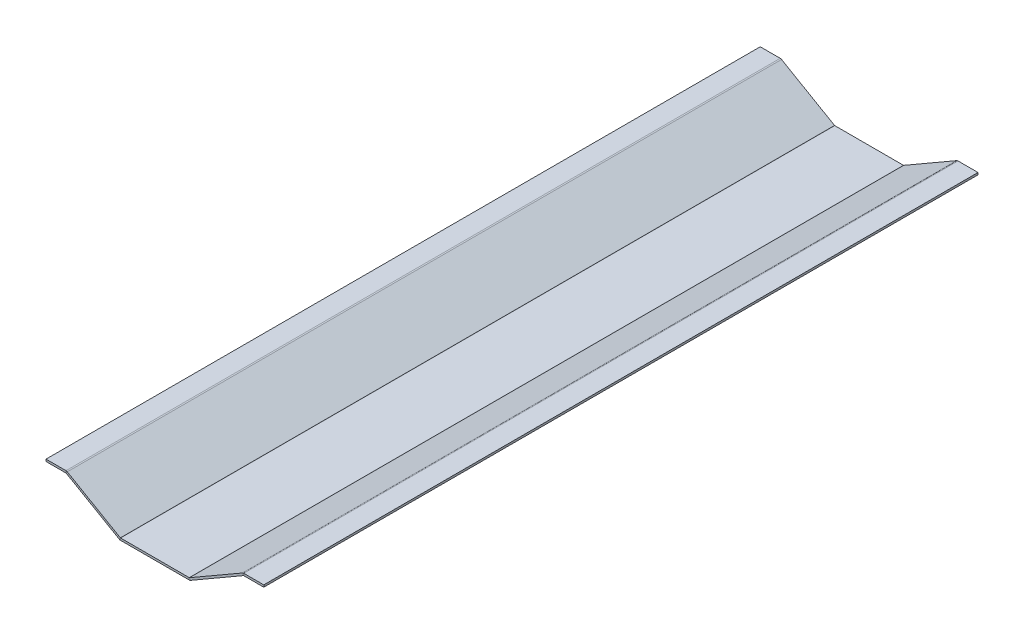
ISO-10303-21;
HEADER;
FILE_DESCRIPTION(('STEP AP214'),'2;1');
FILE_NAME('part.step','',(''),(''),'','','');
FILE_SCHEMA(('AUTOMOTIVE_DESIGN { 1 0 10303 214 1 1 1 1 }'));
ENDSEC;
DATA;
#1=APPLICATION_CONTEXT('core data for automotive mechanical design processes');
#2=APPLICATION_PROTOCOL_DEFINITION('international standard','automotive_design',2000,#1);
#3=PRODUCT_CONTEXT('',#1,'mechanical');
#4=PRODUCT('Part','Part','',(#3));
#5=PRODUCT_RELATED_PRODUCT_CATEGORY('part','',(#4));
#6=PRODUCT_DEFINITION_FORMATION('','',#4);
#7=PRODUCT_DEFINITION_CONTEXT('part definition',#1,'design');
#8=PRODUCT_DEFINITION('design','',#6,#7);
#9=PRODUCT_DEFINITION_SHAPE('','',#8);
#10=(LENGTH_UNIT() NAMED_UNIT(*) SI_UNIT(.MILLI.,.METRE.));
#11=(NAMED_UNIT(*) PLANE_ANGLE_UNIT() SI_UNIT($,.RADIAN.));
#12=(NAMED_UNIT(*) SI_UNIT($,.STERADIAN.) SOLID_ANGLE_UNIT());
#13=UNCERTAINTY_MEASURE_WITH_UNIT(LENGTH_MEASURE(1.E-05),#10,'distance_accuracy_value','');
#14=(GEOMETRIC_REPRESENTATION_CONTEXT(3) GLOBAL_UNCERTAINTY_ASSIGNED_CONTEXT((#13)) GLOBAL_UNIT_ASSIGNED_CONTEXT((#10,
#11,#12)) REPRESENTATION_CONTEXT('',''));
#15=CARTESIAN_POINT('',(0.,0.,0.));
#16=DIRECTION('',(0.,0.,1.));
#17=DIRECTION('',(1.,0.,0.));
#18=AXIS2_PLACEMENT_3D('',#15,#16,#17);
#19=CARTESIAN_POINT('',(127.942286340601,-3.,857.510662197665));
#20=DIRECTION('',(0.,1.,0.));
#21=DIRECTION('',(-1.,0.,0.));
#22=AXIS2_PLACEMENT_3D('',#19,#20,#21);
#23=PLANE('',#22);
#24=DIRECTION('',(-1.,0.,0.));
#25=VECTOR('',#24,1.);
#26=CARTESIAN_POINT('',(127.942286340601,-3.,518.000000000009));
#27=LINE('',#26,#25);
#28=CARTESIAN_POINT('',(128.947095812217,-3.,518.000000000009));
#29=VERTEX_POINT('',#28);
#30=CARTESIAN_POINT('',(157.942286340601,-3.,518.000000000009));
#31=VERTEX_POINT('',#30);
#32=EDGE_CURVE('E271',#29,#31,#27,.F.);
#33=ORIENTED_EDGE('',*,*,#32,.F.);
#34=DIRECTION('',(0.,0.,-1.));
#35=VECTOR('',#34,1.);
#36=CARTESIAN_POINT('',(128.947095812217,-3.,857.510662197665));
#37=LINE('',#36,#35);
#38=CARTESIAN_POINT('',(128.947095812217,-3.,-518.000000000009));
#39=VERTEX_POINT('',#38);
#40=EDGE_CURVE('E310',#29,#39,#37,.T.);
#41=ORIENTED_EDGE('',*,*,#40,.T.);
#42=DIRECTION('',(-1.,0.,0.));
#43=VECTOR('',#42,1.);
#44=CARTESIAN_POINT('',(127.942286340601,-3.,-518.000000000009));
#45=LINE('',#44,#43);
#46=CARTESIAN_POINT('',(157.942286340601,-3.,-518.000000000009));
#47=VERTEX_POINT('',#46);
#48=EDGE_CURVE('E363',#39,#47,#45,.F.);
#49=ORIENTED_EDGE('',*,*,#48,.T.);
#50=DIRECTION('',(0.,0.,-1.));
#51=VECTOR('',#50,1.);
#52=CARTESIAN_POINT('',(157.942286340601,-3.,857.510662197665));
#53=LINE('',#52,#51);
#54=EDGE_CURVE('E11',#31,#47,#53,.T.);
#55=ORIENTED_EDGE('',*,*,#54,.F.);
#56=EDGE_LOOP('',(#33,#41,#49,#55));
#57=FACE_BOUND('',#56,.T.);
#58=ADVANCED_FACE('F37',(#57),#23,.F.);
#59=CARTESIAN_POINT('',(157.942286340601,0.,857.510662197665));
#60=DIRECTION('',(1.,0.,0.));
#61=DIRECTION('',(0.,0.,-1.));
#62=AXIS2_PLACEMENT_3D('',#59,#60,#61);
#63=PLANE('',#62);
#64=DIRECTION('',(0.,0.,-1.));
#65=VECTOR('',#64,1.);
#66=CARTESIAN_POINT('',(157.942286340601,0.,857.510662197665));
#67=LINE('',#66,#65);
#68=CARTESIAN_POINT('',(157.942286340601,0.,518.000000000009));
#69=VERTEX_POINT('',#68);
#70=CARTESIAN_POINT('',(157.942286340601,0.,-518.000000000009));
#71=VERTEX_POINT('',#70);
#72=EDGE_CURVE('E44',#69,#71,#67,.T.);
#73=ORIENTED_EDGE('',*,*,#72,.F.);
#74=DIRECTION('',(0.,1.,0.));
#75=VECTOR('',#74,1.);
#76=CARTESIAN_POINT('',(157.942286340601,0.,518.000000000009));
#77=LINE('',#76,#75);
#78=EDGE_CURVE('E264',#69,#31,#77,.F.);
#79=ORIENTED_EDGE('',*,*,#78,.T.);
#80=ORIENTED_EDGE('',*,*,#54,.T.);
#81=DIRECTION('',(0.,1.,0.));
#82=VECTOR('',#81,1.);
#83=CARTESIAN_POINT('',(157.942286340601,0.,-518.000000000009));
#84=LINE('',#83,#82);
#85=EDGE_CURVE('E358',#71,#47,#84,.F.);
#86=ORIENTED_EDGE('',*,*,#85,.F.);
#87=EDGE_LOOP('',(#73,#79,#80,#86));
#88=FACE_BOUND('',#87,.T.);
#89=ADVANCED_FACE('F366',(#88),#63,.T.);
#90=CARTESIAN_POINT('',(127.942286340601,0.,857.510662197665));
#91=DIRECTION('',(0.,1.,0.));
#92=DIRECTION('',(-1.,0.,0.));
#93=AXIS2_PLACEMENT_3D('',#90,#91,#92);
#94=PLANE('',#93);
#95=DIRECTION('',(0.,0.,-1.));
#96=VECTOR('',#95,1.);
#97=CARTESIAN_POINT('',(128.947095812217,0.,857.510662197665));
#98=LINE('',#97,#96);
#99=CARTESIAN_POINT('',(128.947095812217,0.,518.000000000009));
#100=VERTEX_POINT('',#99);
#101=CARTESIAN_POINT('',(128.947095812217,0.,-518.000000000009));
#102=VERTEX_POINT('',#101);
#103=EDGE_CURVE('E342',#100,#102,#98,.T.);
#104=ORIENTED_EDGE('',*,*,#103,.F.);
#105=DIRECTION('',(1.,0.,0.));
#106=VECTOR('',#105,1.);
#107=CARTESIAN_POINT('',(127.942286340602,0.,518.000000000009));
#108=LINE('',#107,#106);
#109=EDGE_CURVE('E256',#100,#69,#108,.T.);
#110=ORIENTED_EDGE('',*,*,#109,.T.);
#111=ORIENTED_EDGE('',*,*,#72,.T.);
#112=DIRECTION('',(1.,0.,0.));
#113=VECTOR('',#112,1.);
#114=CARTESIAN_POINT('',(127.942286340602,0.,-518.000000000009));
#115=LINE('',#114,#113);
#116=EDGE_CURVE('E349',#102,#71,#115,.T.);
#117=ORIENTED_EDGE('',*,*,#116,.F.);
#118=EDGE_LOOP('',(#104,#110,#111,#117));
#119=FACE_BOUND('',#118,.T.);
#120=ADVANCED_FACE('F348',(#119),#94,.T.);
#121=CARTESIAN_POINT('',(128.947095812217,-3.75000000000001,857.510662197665));
#122=DIRECTION('',(0.,0.,-1.));
#123=DIRECTION('',(-1.,0.,0.));
#124=AXIS2_PLACEMENT_3D('',#121,#122,#123);
#125=CYLINDRICAL_SURFACE('',#124,3.75);
#126=DIRECTION('',(0.,0.,-1.));
#127=VECTOR('',#126,1.);
#128=CARTESIAN_POINT('',(127.072095812217,-0.502404735808364,857.510662197665));
#129=LINE('',#128,#127);
#130=CARTESIAN_POINT('',(127.072095812217,-0.502404735808357,518.000000000009));
#131=VERTEX_POINT('',#130);
#132=CARTESIAN_POINT('',(127.072095812217,-0.502404735808357,-518.000000000009));
#133=VERTEX_POINT('',#132);
#134=EDGE_CURVE('E340',#131,#133,#129,.T.);
#135=ORIENTED_EDGE('',*,*,#134,.F.);
#136=CARTESIAN_POINT('',(128.947095812217,-3.75000000000001,518.000000000009));
#137=DIRECTION('',(0.,0.,-1.));
#138=DIRECTION('',(-1.,0.,0.));
#139=AXIS2_PLACEMENT_3D('',#136,#137,#138);
#140=CIRCLE('',#139,3.75);
#141=EDGE_CURVE('E59',#100,#131,#140,.F.);
#142=ORIENTED_EDGE('',*,*,#141,.F.);
#143=ORIENTED_EDGE('',*,*,#103,.T.);
#144=CARTESIAN_POINT('',(128.947095812217,-3.75000000000001,-518.000000000009));
#145=DIRECTION('',(0.,0.,-1.));
#146=DIRECTION('',(-1.,0.,0.));
#147=AXIS2_PLACEMENT_3D('',#144,#145,#146);
#148=CIRCLE('',#147,3.75);
#149=EDGE_CURVE('E364',#102,#133,#148,.F.);
#150=ORIENTED_EDGE('',*,*,#149,.T.);
#151=EDGE_LOOP('',(#135,#142,#143,#150));
#152=FACE_BOUND('',#151,.T.);
#153=ADVANCED_FACE('F411',(#152),#125,.T.);
#154=CARTESIAN_POINT('',(50.,-45.,857.510662197665));
#155=DIRECTION('',(-0.499999999999995,0.866025403784442,0.));
#156=DIRECTION('',(-0.866025403784442,-0.499999999999995,0.));
#157=AXIS2_PLACEMENT_3D('',#154,#155,#156);
#158=PLANE('',#157);
#159=DIRECTION('',(0.,0.,-1.));
#160=VECTOR('',#159,1.);
#161=CARTESIAN_POINT('',(50.1740381056767,-44.8995190528384,857.510662197665));
#162=LINE('',#161,#160);
#163=CARTESIAN_POINT('',(50.1740381056767,-44.8995190528384,518.000000000009));
#164=VERTEX_POINT('',#163);
#165=CARTESIAN_POINT('',(50.1740381056767,-44.8995190528384,-518.000000000009));
#166=VERTEX_POINT('',#165);
#167=EDGE_CURVE('E338',#164,#166,#162,.T.);
#168=ORIENTED_EDGE('',*,*,#167,.F.);
#169=DIRECTION('',(-0.866025403784442,-0.499999999999995,0.));
#170=VECTOR('',#169,1.);
#171=CARTESIAN_POINT('',(50.,-45.,518.000000000009));
#172=LINE('',#171,#170);
#173=EDGE_CURVE('E303',#164,#131,#172,.F.);
#174=ORIENTED_EDGE('',*,*,#173,.T.);
#175=ORIENTED_EDGE('',*,*,#134,.T.);
#176=DIRECTION('',(-0.866025403784442,-0.499999999999995,0.));
#177=VECTOR('',#176,1.);
#178=CARTESIAN_POINT('',(50.,-45.,-518.000000000009));
#179=LINE('',#178,#177);
#180=EDGE_CURVE('E233',#166,#133,#179,.F.);
#181=ORIENTED_EDGE('',*,*,#180,.F.);
#182=EDGE_LOOP('',(#168,#174,#175,#181));
#183=FACE_BOUND('',#182,.T.);
#184=ADVANCED_FACE('F404',(#183),#158,.T.);
#185=CARTESIAN_POINT('',(49.7990381056767,-44.25,857.510662197665));
#186=DIRECTION('',(0.,0.,-1.));
#187=DIRECTION('',(-1.,0.,0.));
#188=AXIS2_PLACEMENT_3D('',#185,#186,#187);
#189=CYLINDRICAL_SURFACE('',#188,0.75);
#190=DIRECTION('',(0.,0.,-1.));
#191=VECTOR('',#190,1.);
#192=CARTESIAN_POINT('',(49.7990381056767,-45.,857.510662197665));
#193=LINE('',#192,#191);
#194=CARTESIAN_POINT('',(49.7990381056767,-45.,518.000000000009));
#195=VERTEX_POINT('',#194);
#196=CARTESIAN_POINT('',(49.7990381056767,-45.,-518.000000000009));
#197=VERTEX_POINT('',#196);
#198=EDGE_CURVE('E336',#195,#197,#193,.T.);
#199=ORIENTED_EDGE('',*,*,#198,.F.);
#200=CARTESIAN_POINT('',(49.7990381056767,-44.25,518.000000000009));
#201=DIRECTION('',(0.,0.,-1.));
#202=DIRECTION('',(-1.,0.,0.));
#203=AXIS2_PLACEMENT_3D('',#200,#201,#202);
#204=CIRCLE('',#203,0.75);
#205=EDGE_CURVE('E244',#164,#195,#204,.T.);
#206=ORIENTED_EDGE('',*,*,#205,.F.);
#207=ORIENTED_EDGE('',*,*,#167,.T.);
#208=CARTESIAN_POINT('',(49.7990381056767,-44.25,-518.000000000009));
#209=DIRECTION('',(0.,0.,-1.));
#210=DIRECTION('',(-1.,0.,0.));
#211=AXIS2_PLACEMENT_3D('',#208,#209,#210);
#212=CIRCLE('',#211,0.75);
#213=EDGE_CURVE('E209',#166,#197,#212,.T.);
#214=ORIENTED_EDGE('',*,*,#213,.T.);
#215=EDGE_LOOP('',(#199,#206,#207,#214));
#216=FACE_BOUND('',#215,.T.);
#217=ADVANCED_FACE('F399',(#216),#189,.F.);
#218=CARTESIAN_POINT('',(-50.,-45.,857.510662197665));
#219=DIRECTION('',(0.,1.,0.));
#220=DIRECTION('',(0.,0.,1.));
#221=AXIS2_PLACEMENT_3D('',#218,#219,#220);
#222=PLANE('',#221);
#223=DIRECTION('',(0.,0.,-1.));
#224=VECTOR('',#223,1.);
#225=CARTESIAN_POINT('',(-49.7990381056767,-45.,857.510662197665));
#226=LINE('',#225,#224);
#227=CARTESIAN_POINT('',(-49.7990381056767,-45.,518.000000000008));
#228=VERTEX_POINT('',#227);
#229=CARTESIAN_POINT('',(-49.7990381056767,-45.,-518.000000000008));
#230=VERTEX_POINT('',#229);
#231=EDGE_CURVE('E334',#228,#230,#226,.T.);
#232=ORIENTED_EDGE('',*,*,#231,.F.);
#233=DIRECTION('',(1.,0.,0.));
#234=VECTOR('',#233,1.);
#235=CARTESIAN_POINT('',(-50.,-45.,518.000000000009));
#236=LINE('',#235,#234);
#237=EDGE_CURVE('E280',#228,#195,#236,.T.);
#238=ORIENTED_EDGE('',*,*,#237,.T.);
#239=ORIENTED_EDGE('',*,*,#198,.T.);
#240=DIRECTION('',(1.,0.,0.));
#241=VECTOR('',#240,1.);
#242=CARTESIAN_POINT('',(-50.,-45.,-518.000000000009));
#243=LINE('',#242,#241);
#244=EDGE_CURVE('E197',#230,#197,#243,.T.);
#245=ORIENTED_EDGE('',*,*,#244,.F.);
#246=EDGE_LOOP('',(#232,#238,#239,#245));
#247=FACE_BOUND('',#246,.T.);
#248=ADVANCED_FACE('F441',(#247),#222,.T.);
#249=CARTESIAN_POINT('',(-49.7990381056767,-44.25,857.510662197665));
#250=DIRECTION('',(0.,0.,-1.));
#251=DIRECTION('',(-1.,0.,0.));
#252=AXIS2_PLACEMENT_3D('',#249,#250,#251);
#253=CYLINDRICAL_SURFACE('',#252,0.75);
#254=DIRECTION('',(0.,0.,-1.));
#255=VECTOR('',#254,1.);
#256=CARTESIAN_POINT('',(-50.1740381056767,-44.8995190528384,857.510662197665));
#257=LINE('',#256,#255);
#258=CARTESIAN_POINT('',(-50.1740381056767,-44.8995190528384,518.000000000008));
#259=VERTEX_POINT('',#258);
#260=CARTESIAN_POINT('',(-50.1740381056767,-44.8995190528384,-518.000000000008));
#261=VERTEX_POINT('',#260);
#262=EDGE_CURVE('E332',#259,#261,#257,.T.);
#263=ORIENTED_EDGE('',*,*,#262,.F.);
#264=CARTESIAN_POINT('',(-49.7990381056767,-44.25,518.000000000008));
#265=DIRECTION('',(0.,0.,-1.));
#266=DIRECTION('',(-1.,0.,0.));
#267=AXIS2_PLACEMENT_3D('',#264,#265,#266);
#268=CIRCLE('',#267,0.75);
#269=EDGE_CURVE('E245',#228,#259,#268,.T.);
#270=ORIENTED_EDGE('',*,*,#269,.F.);
#271=ORIENTED_EDGE('',*,*,#231,.T.);
#272=CARTESIAN_POINT('',(-49.7990381056767,-44.25,-518.000000000008));
#273=DIRECTION('',(0.,0.,-1.));
#274=DIRECTION('',(-1.,0.,0.));
#275=AXIS2_PLACEMENT_3D('',#272,#273,#274);
#276=CIRCLE('',#275,0.75);
#277=EDGE_CURVE('E210',#230,#261,#276,.T.);
#278=ORIENTED_EDGE('',*,*,#277,.T.);
#279=EDGE_LOOP('',(#263,#270,#271,#278));
#280=FACE_BOUND('',#279,.T.);
#281=ADVANCED_FACE('F444',(#280),#253,.F.);
#282=CARTESIAN_POINT('',(-50.,-45.,857.510662197665));
#283=DIRECTION('',(0.499999999999995,0.866025403784442,0.));
#284=DIRECTION('',(-0.866025403784442,0.499999999999995,0.));
#285=AXIS2_PLACEMENT_3D('',#282,#283,#284);
#286=PLANE('',#285);
#287=DIRECTION('',(0.,0.,-1.));
#288=VECTOR('',#287,1.);
#289=CARTESIAN_POINT('',(-127.072095812217,-0.502404735808364,857.510662197665));
#290=LINE('',#289,#288);
#291=CARTESIAN_POINT('',(-127.072095812218,-0.502404735808254,518.000000000008));
#292=VERTEX_POINT('',#291);
#293=CARTESIAN_POINT('',(-127.072095812218,-0.502404735808254,-518.000000000008));
#294=VERTEX_POINT('',#293);
#295=EDGE_CURVE('E330',#292,#294,#290,.T.);
#296=ORIENTED_EDGE('',*,*,#295,.F.);
#297=DIRECTION('',(-0.866025403784442,0.499999999999995,0.));
#298=VECTOR('',#297,1.);
#299=CARTESIAN_POINT('',(-50.,-45.,518.000000000008));
#300=LINE('',#299,#298);
#301=EDGE_CURVE('E293',#292,#259,#300,.F.);
#302=ORIENTED_EDGE('',*,*,#301,.T.);
#303=ORIENTED_EDGE('',*,*,#262,.T.);
#304=DIRECTION('',(-0.866025403784442,0.499999999999995,0.));
#305=VECTOR('',#304,1.);
#306=CARTESIAN_POINT('',(-50.,-45.,-518.000000000008));
#307=LINE('',#306,#305);
#308=EDGE_CURVE('E224',#294,#261,#307,.F.);
#309=ORIENTED_EDGE('',*,*,#308,.F.);
#310=EDGE_LOOP('',(#296,#302,#303,#309));
#311=FACE_BOUND('',#310,.T.);
#312=ADVANCED_FACE('F448',(#311),#286,.T.);
#313=CARTESIAN_POINT('',(-128.947095812217,-3.75000000000001,857.510662197665));
#314=DIRECTION('',(0.,0.,-1.));
#315=DIRECTION('',(-1.,0.,0.));
#316=AXIS2_PLACEMENT_3D('',#313,#314,#315);
#317=CYLINDRICAL_SURFACE('',#316,3.75);
#318=DIRECTION('',(0.,0.,-1.));
#319=VECTOR('',#318,1.);
#320=CARTESIAN_POINT('',(-128.947095812217,0.,857.510662197665));
#321=LINE('',#320,#319);
#322=CARTESIAN_POINT('',(-128.947095812217,0.,518.000000000008));
#323=VERTEX_POINT('',#322);
#324=CARTESIAN_POINT('',(-128.947095812217,0.,-518.000000000008));
#325=VERTEX_POINT('',#324);
#326=EDGE_CURVE('E328',#323,#325,#321,.T.);
#327=ORIENTED_EDGE('',*,*,#326,.F.);
#328=CARTESIAN_POINT('',(-128.947095812217,-3.75000000000001,518.000000000008));
#329=DIRECTION('',(0.,0.,-1.));
#330=DIRECTION('',(-1.,0.,0.));
#331=AXIS2_PLACEMENT_3D('',#328,#329,#330);
#332=CIRCLE('',#331,3.75);
#333=EDGE_CURVE('E250',#292,#323,#332,.F.);
#334=ORIENTED_EDGE('',*,*,#333,.F.);
#335=ORIENTED_EDGE('',*,*,#295,.T.);
#336=CARTESIAN_POINT('',(-128.947095812217,-3.75000000000001,-518.000000000008));
#337=DIRECTION('',(0.,0.,-1.));
#338=DIRECTION('',(-1.,0.,0.));
#339=AXIS2_PLACEMENT_3D('',#336,#337,#338);
#340=CIRCLE('',#339,3.75);
#341=EDGE_CURVE('E387',#294,#325,#340,.F.);
#342=ORIENTED_EDGE('',*,*,#341,.T.);
#343=EDGE_LOOP('',(#327,#334,#335,#342));
#344=FACE_BOUND('',#343,.T.);
#345=ADVANCED_FACE('F452',(#344),#317,.T.);
#346=CARTESIAN_POINT('',(-127.942286340601,0.,857.510662197665));
#347=DIRECTION('',(0.,1.,0.));
#348=DIRECTION('',(-1.,0.,0.));
#349=AXIS2_PLACEMENT_3D('',#346,#347,#348);
#350=PLANE('',#349);
#351=DIRECTION('',(0.,0.,-1.));
#352=VECTOR('',#351,1.);
#353=CARTESIAN_POINT('',(-157.942286340601,0.,857.510662197665));
#354=LINE('',#353,#352);
#355=CARTESIAN_POINT('',(-157.942286340601,0.,518.000000000008));
#356=VERTEX_POINT('',#355);
#357=CARTESIAN_POINT('',(-157.942286340601,0.,-518.000000000008));
#358=VERTEX_POINT('',#357);
#359=EDGE_CURVE('E326',#356,#358,#354,.T.);
#360=ORIENTED_EDGE('',*,*,#359,.F.);
#361=DIRECTION('',(-1.,0.,0.));
#362=VECTOR('',#361,1.);
#363=CARTESIAN_POINT('',(-127.942286340601,0.,518.000000000008));
#364=LINE('',#363,#362);
#365=EDGE_CURVE('E257',#356,#323,#364,.F.);
#366=ORIENTED_EDGE('',*,*,#365,.T.);
#367=ORIENTED_EDGE('',*,*,#326,.T.);
#368=DIRECTION('',(-1.,0.,0.));
#369=VECTOR('',#368,1.);
#370=CARTESIAN_POINT('',(-127.942286340601,0.,-518.000000000008));
#371=LINE('',#370,#369);
#372=EDGE_CURVE('E371',#358,#325,#371,.F.);
#373=ORIENTED_EDGE('',*,*,#372,.F.);
#374=EDGE_LOOP('',(#360,#366,#367,#373));
#375=FACE_BOUND('',#374,.T.);
#376=ADVANCED_FACE('F456',(#375),#350,.T.);
#377=CARTESIAN_POINT('',(-157.942286340601,-3.,857.510662197665));
#378=DIRECTION('',(-1.,0.,0.));
#379=DIRECTION('',(0.,0.,1.));
#380=AXIS2_PLACEMENT_3D('',#377,#378,#379);
#381=PLANE('',#380);
#382=DIRECTION('',(0.,0.,-1.));
#383=VECTOR('',#382,1.);
#384=CARTESIAN_POINT('',(-157.942286340601,-3.,857.510662197665));
#385=LINE('',#384,#383);
#386=CARTESIAN_POINT('',(-157.942286340601,-3.,518.000000000008));
#387=VERTEX_POINT('',#386);
#388=CARTESIAN_POINT('',(-157.942286340601,-3.,-518.000000000008));
#389=VERTEX_POINT('',#388);
#390=EDGE_CURVE('E324',#387,#389,#385,.T.);
#391=ORIENTED_EDGE('',*,*,#390,.F.);
#392=DIRECTION('',(0.,-1.,0.));
#393=VECTOR('',#392,1.);
#394=CARTESIAN_POINT('',(-157.942286340601,-3.,518.000000000008));
#395=LINE('',#394,#393);
#396=EDGE_CURVE('E260',#387,#356,#395,.F.);
#397=ORIENTED_EDGE('',*,*,#396,.T.);
#398=ORIENTED_EDGE('',*,*,#359,.T.);
#399=DIRECTION('',(0.,-1.,0.));
#400=VECTOR('',#399,1.);
#401=CARTESIAN_POINT('',(-157.942286340601,-3.,-518.000000000008));
#402=LINE('',#401,#400);
#403=EDGE_CURVE('E375',#389,#358,#402,.F.);
#404=ORIENTED_EDGE('',*,*,#403,.F.);
#405=EDGE_LOOP('',(#391,#397,#398,#404));
#406=FACE_BOUND('',#405,.T.);
#407=ADVANCED_FACE('F460',(#406),#381,.T.);
#408=CARTESIAN_POINT('',(-127.942286340601,-3.,857.510662197665));
#409=DIRECTION('',(0.,1.,0.));
#410=DIRECTION('',(-1.,0.,0.));
#411=AXIS2_PLACEMENT_3D('',#408,#409,#410);
#412=PLANE('',#411);
#413=DIRECTION('',(1.,0.,0.));
#414=VECTOR('',#413,1.);
#415=CARTESIAN_POINT('',(-127.942286340599,-3.,518.000000000008));
#416=LINE('',#415,#414);
#417=CARTESIAN_POINT('',(-128.947095812217,-3.00000000000001,518.000000000008));
#418=VERTEX_POINT('',#417);
#419=EDGE_CURVE('E261',#387,#418,#416,.T.);
#420=ORIENTED_EDGE('',*,*,#419,.F.);
#421=ORIENTED_EDGE('',*,*,#390,.T.);
#422=DIRECTION('',(1.,0.,0.));
#423=VECTOR('',#422,1.);
#424=CARTESIAN_POINT('',(-127.942286340599,-3.,-518.000000000008));
#425=LINE('',#424,#423);
#426=CARTESIAN_POINT('',(-128.947095812217,-3.00000000000001,-518.000000000008));
#427=VERTEX_POINT('',#426);
#428=EDGE_CURVE('E368',#389,#427,#425,.T.);
#429=ORIENTED_EDGE('',*,*,#428,.T.);
#430=DIRECTION('',(0.,0.,-1.));
#431=VECTOR('',#430,1.);
#432=CARTESIAN_POINT('',(-128.947095812217,-3.00000000000001,857.510662197665));
#433=LINE('',#432,#431);
#434=EDGE_CURVE('E322',#418,#427,#433,.T.);
#435=ORIENTED_EDGE('',*,*,#434,.F.);
#436=EDGE_LOOP('',(#420,#421,#429,#435));
#437=FACE_BOUND('',#436,.T.);
#438=ADVANCED_FACE('F464',(#437),#412,.F.);
#439=CARTESIAN_POINT('',(-128.947095812217,-3.75000000000001,857.510662197665));
#440=DIRECTION('',(0.,0.,-1.));
#441=DIRECTION('',(-1.,0.,0.));
#442=AXIS2_PLACEMENT_3D('',#439,#440,#441);
#443=CYLINDRICAL_SURFACE('',#442,0.75);
#444=CARTESIAN_POINT('',(-128.947095812217,-3.75000000000001,518.000000000008));
#445=DIRECTION('',(0.,0.,1.));
#446=DIRECTION('',(1.,0.,0.));
#447=AXIS2_PLACEMENT_3D('',#444,#445,#446);
#448=CIRCLE('',#447,0.75);
#449=CARTESIAN_POINT('',(-128.572095812217,-3.10048094716166,518.000000000008));
#450=VERTEX_POINT('',#449);
#451=EDGE_CURVE('E241',#418,#450,#448,.F.);
#452=ORIENTED_EDGE('',*,*,#451,.F.);
#453=ORIENTED_EDGE('',*,*,#434,.T.);
#454=CARTESIAN_POINT('',(-128.947095812217,-3.75000000000001,-518.000000000008));
#455=DIRECTION('',(0.,0.,1.));
#456=DIRECTION('',(1.,0.,0.));
#457=AXIS2_PLACEMENT_3D('',#454,#455,#456);
#458=CIRCLE('',#457,0.75);
#459=CARTESIAN_POINT('',(-128.572095812217,-3.10048094716166,-518.000000000008));
#460=VERTEX_POINT('',#459);
#461=EDGE_CURVE('E391',#427,#460,#458,.F.);
#462=ORIENTED_EDGE('',*,*,#461,.T.);
#463=DIRECTION('',(0.,0.,-1.));
#464=VECTOR('',#463,1.);
#465=CARTESIAN_POINT('',(-128.572095812217,-3.10048094716166,857.510662197665));
#466=LINE('',#465,#464);
#467=EDGE_CURVE('E320',#450,#460,#466,.T.);
#468=ORIENTED_EDGE('',*,*,#467,.F.);
#469=EDGE_LOOP('',(#452,#453,#462,#468));
#470=FACE_BOUND('',#469,.T.);
#471=ADVANCED_FACE('F468',(#470),#443,.F.);
#472=CARTESIAN_POINT('',(-51.5,-47.5980762113534,857.510662197665));
#473=DIRECTION('',(0.499999999999995,0.866025403784442,0.));
#474=DIRECTION('',(-0.866025403784442,0.499999999999995,0.));
#475=AXIS2_PLACEMENT_3D('',#472,#473,#474);
#476=PLANE('',#475);
#477=DIRECTION('',(0.866025403784442,-0.499999999999995,0.));
#478=VECTOR('',#477,1.);
#479=CARTESIAN_POINT('',(-51.4999999999991,-47.5980762113539,518.000000000008));
#480=LINE('',#479,#478);
#481=CARTESIAN_POINT('',(-51.6740381056766,-47.4975952641917,518.000000000008));
#482=VERTEX_POINT('',#481);
#483=EDGE_CURVE('E268',#450,#482,#480,.T.);
#484=ORIENTED_EDGE('',*,*,#483,.F.);
#485=ORIENTED_EDGE('',*,*,#467,.T.);
#486=DIRECTION('',(0.866025403784442,-0.499999999999995,0.));
#487=VECTOR('',#486,1.);
#488=CARTESIAN_POINT('',(-51.4999999999991,-47.5980762113539,-518.000000000008));
#489=LINE('',#488,#487);
#490=CARTESIAN_POINT('',(-51.6740381056766,-47.4975952641917,-518.000000000008));
#491=VERTEX_POINT('',#490);
#492=EDGE_CURVE('E227',#460,#491,#489,.T.);
#493=ORIENTED_EDGE('',*,*,#492,.T.);
#494=DIRECTION('',(0.,0.,-1.));
#495=VECTOR('',#494,1.);
#496=CARTESIAN_POINT('',(-51.6740381056766,-47.4975952641917,857.510662197665));
#497=LINE('',#496,#495);
#498=EDGE_CURVE('E318',#482,#491,#497,.T.);
#499=ORIENTED_EDGE('',*,*,#498,.F.);
#500=EDGE_LOOP('',(#484,#485,#493,#499));
#501=FACE_BOUND('',#500,.T.);
#502=ADVANCED_FACE('F472',(#501),#476,.F.);
#503=CARTESIAN_POINT('',(-49.7990381056767,-44.25,857.510662197665));
#504=DIRECTION('',(0.,0.,-1.));
#505=DIRECTION('',(-1.,0.,0.));
#506=AXIS2_PLACEMENT_3D('',#503,#504,#505);
#507=CYLINDRICAL_SURFACE('',#506,3.75);
#508=CARTESIAN_POINT('',(-49.7990381056767,-44.25,518.000000000008));
#509=DIRECTION('',(0.,0.,1.));
#510=DIRECTION('',(1.,0.,0.));
#511=AXIS2_PLACEMENT_3D('',#508,#509,#510);
#512=CIRCLE('',#511,3.75);
#513=CARTESIAN_POINT('',(-49.7990381056767,-48.,518.000000000009));
#514=VERTEX_POINT('',#513);
#515=EDGE_CURVE('E248',#482,#514,#512,.T.);
#516=ORIENTED_EDGE('',*,*,#515,.F.);
#517=ORIENTED_EDGE('',*,*,#498,.T.);
#518=CARTESIAN_POINT('',(-49.7990381056767,-44.25,-518.000000000008));
#519=DIRECTION('',(0.,0.,1.));
#520=DIRECTION('',(1.,0.,0.));
#521=AXIS2_PLACEMENT_3D('',#518,#519,#520);
#522=CIRCLE('',#521,3.75);
#523=CARTESIAN_POINT('',(-49.7990381056767,-48.,-518.000000000009));
#524=VERTEX_POINT('',#523);
#525=EDGE_CURVE('E390',#491,#524,#522,.T.);
#526=ORIENTED_EDGE('',*,*,#525,.T.);
#527=DIRECTION('',(0.,0.,-1.));
#528=VECTOR('',#527,1.);
#529=CARTESIAN_POINT('',(-49.7990381056767,-48.,857.510662197665));
#530=LINE('',#529,#528);
#531=EDGE_CURVE('E184',#514,#524,#530,.T.);
#532=ORIENTED_EDGE('',*,*,#531,.F.);
#533=EDGE_LOOP('',(#516,#517,#526,#532));
#534=FACE_BOUND('',#533,.T.);
#535=ADVANCED_FACE('F476',(#534),#507,.T.);
#536=CARTESIAN_POINT('',(-50.,-48.,857.510662197665));
#537=DIRECTION('',(0.,1.,0.));
#538=DIRECTION('',(0.,0.,1.));
#539=AXIS2_PLACEMENT_3D('',#536,#537,#538);
#540=PLANE('',#539);
#541=DIRECTION('',(1.,0.,0.));
#542=VECTOR('',#541,1.);
#543=CARTESIAN_POINT('',(-49.9999999999988,-48.,518.000000000008));
#544=LINE('',#543,#542);
#545=CARTESIAN_POINT('',(49.7990381056767,-48.,518.000000000009));
#546=VERTEX_POINT('',#545);
#547=EDGE_CURVE('E284',#514,#546,#544,.T.);
#548=ORIENTED_EDGE('',*,*,#547,.F.);
#549=ORIENTED_EDGE('',*,*,#531,.T.);
#550=DIRECTION('',(1.,0.,0.));
#551=VECTOR('',#550,1.);
#552=CARTESIAN_POINT('',(-49.9999999999988,-48.,-518.000000000008));
#553=LINE('',#552,#551);
#554=CARTESIAN_POINT('',(49.7990381056767,-48.,-518.000000000009));
#555=VERTEX_POINT('',#554);
#556=EDGE_CURVE('E194',#524,#555,#553,.T.);
#557=ORIENTED_EDGE('',*,*,#556,.T.);
#558=DIRECTION('',(0.,0.,-1.));
#559=VECTOR('',#558,1.);
#560=CARTESIAN_POINT('',(49.7990381056767,-48.,857.510662197665));
#561=LINE('',#560,#559);
#562=EDGE_CURVE('E174',#546,#555,#561,.T.);
#563=ORIENTED_EDGE('',*,*,#562,.F.);
#564=EDGE_LOOP('',(#548,#549,#557,#563));
#565=FACE_BOUND('',#564,.T.);
#566=ADVANCED_FACE('F212',(#565),#540,.F.);
#567=CARTESIAN_POINT('',(49.7990381056767,-44.25,857.510662197665));
#568=DIRECTION('',(0.,0.,-1.));
#569=DIRECTION('',(-1.,0.,0.));
#570=AXIS2_PLACEMENT_3D('',#567,#568,#569);
#571=CYLINDRICAL_SURFACE('',#570,3.75);
#572=CARTESIAN_POINT('',(49.7990381056767,-44.25,518.000000000009));
#573=DIRECTION('',(0.,0.,1.));
#574=DIRECTION('',(1.,0.,0.));
#575=AXIS2_PLACEMENT_3D('',#572,#573,#574);
#576=CIRCLE('',#575,3.75);
#577=CARTESIAN_POINT('',(51.6740381056766,-47.4975952641917,518.000000000009));
#578=VERTEX_POINT('',#577);
#579=EDGE_CURVE('E180',#546,#578,#576,.T.);
#580=ORIENTED_EDGE('',*,*,#579,.F.);
#581=ORIENTED_EDGE('',*,*,#562,.T.);
#582=CARTESIAN_POINT('',(49.7990381056767,-44.25,-518.000000000009));
#583=DIRECTION('',(0.,0.,1.));
#584=DIRECTION('',(1.,0.,0.));
#585=AXIS2_PLACEMENT_3D('',#582,#583,#584);
#586=CIRCLE('',#585,3.75);
#587=CARTESIAN_POINT('',(51.6740381056766,-47.4975952641917,-518.000000000009));
#588=VERTEX_POINT('',#587);
#589=EDGE_CURVE('E179',#555,#588,#586,.T.);
#590=ORIENTED_EDGE('',*,*,#589,.T.);
#591=DIRECTION('',(0.,0.,-1.));
#592=VECTOR('',#591,1.);
#593=CARTESIAN_POINT('',(51.6740381056766,-47.4975952641917,857.510662197665));
#594=LINE('',#593,#592);
#595=EDGE_CURVE('E185',#578,#588,#594,.T.);
#596=ORIENTED_EDGE('',*,*,#595,.F.);
#597=EDGE_LOOP('',(#580,#581,#590,#596));
#598=FACE_BOUND('',#597,.T.);
#599=ADVANCED_FACE('F176',(#598),#571,.T.);
#600=CARTESIAN_POINT('',(51.5,-47.5980762113534,857.510662197665));
#601=DIRECTION('',(-0.499999999999995,0.866025403784442,0.));
#602=DIRECTION('',(-0.866025403784442,-0.499999999999995,0.));
#603=AXIS2_PLACEMENT_3D('',#600,#601,#602);
#604=PLANE('',#603);
#605=DIRECTION('',(0.866025403784442,0.499999999999995,0.));
#606=VECTOR('',#605,1.);
#607=CARTESIAN_POINT('',(51.5000000000009,-47.5980762113529,518.000000000009));
#608=LINE('',#607,#606);
#609=CARTESIAN_POINT('',(128.572095812217,-3.10048094716167,518.000000000009));
#610=VERTEX_POINT('',#609);
#611=EDGE_CURVE('E51',#578,#610,#608,.T.);
#612=ORIENTED_EDGE('',*,*,#611,.F.);
#613=ORIENTED_EDGE('',*,*,#595,.T.);
#614=DIRECTION('',(0.866025403784442,0.499999999999995,0.));
#615=VECTOR('',#614,1.);
#616=CARTESIAN_POINT('',(51.5000000000009,-47.5980762113529,-518.000000000009));
#617=LINE('',#616,#615);
#618=CARTESIAN_POINT('',(128.572095812217,-3.10048094716167,-518.000000000009));
#619=VERTEX_POINT('',#618);
#620=EDGE_CURVE('E201',#588,#619,#617,.T.);
#621=ORIENTED_EDGE('',*,*,#620,.T.);
#622=DIRECTION('',(0.,0.,-1.));
#623=VECTOR('',#622,1.);
#624=CARTESIAN_POINT('',(128.572095812217,-3.10048094716167,857.510662197665));
#625=LINE('',#624,#623);
#626=EDGE_CURVE('E314',#610,#619,#625,.T.);
#627=ORIENTED_EDGE('',*,*,#626,.F.);
#628=EDGE_LOOP('',(#612,#613,#621,#627));
#629=FACE_BOUND('',#628,.T.);
#630=ADVANCED_FACE('F418',(#629),#604,.F.);
#631=CARTESIAN_POINT('',(128.947095812217,-3.75000000000001,857.510662197665));
#632=DIRECTION('',(0.,0.,-1.));
#633=DIRECTION('',(-1.,0.,0.));
#634=AXIS2_PLACEMENT_3D('',#631,#632,#633);
#635=CYLINDRICAL_SURFACE('',#634,0.75);
#636=CARTESIAN_POINT('',(128.947095812217,-3.75000000000001,518.000000000009));
#637=DIRECTION('',(0.,0.,1.));
#638=DIRECTION('',(1.,0.,0.));
#639=AXIS2_PLACEMENT_3D('',#636,#637,#638);
#640=CIRCLE('',#639,0.75);
#641=EDGE_CURVE('E247',#610,#29,#640,.F.);
#642=ORIENTED_EDGE('',*,*,#641,.F.);
#643=ORIENTED_EDGE('',*,*,#626,.T.);
#644=CARTESIAN_POINT('',(128.947095812217,-3.75000000000001,-518.000000000009));
#645=DIRECTION('',(0.,0.,1.));
#646=DIRECTION('',(1.,0.,0.));
#647=AXIS2_PLACEMENT_3D('',#644,#645,#646);
#648=CIRCLE('',#647,0.75);
#649=EDGE_CURVE('E384',#619,#39,#648,.F.);
#650=ORIENTED_EDGE('',*,*,#649,.T.);
#651=ORIENTED_EDGE('',*,*,#40,.F.);
#652=EDGE_LOOP('',(#642,#643,#650,#651));
#653=FACE_BOUND('',#652,.T.);
#654=ADVANCED_FACE('F420',(#653),#635,.F.);
#655=CARTESIAN_POINT('',(51.5000000000009,-47.5980762113529,518.000000000009));
#656=DIRECTION('',(0.,0.,1.));
#657=DIRECTION('',(0.866025403784442,0.499999999999995,0.));
#658=AXIS2_PLACEMENT_3D('',#655,#656,#657);
#659=PLANE('',#658);
#660=ORIENTED_EDGE('',*,*,#611,.T.);
#661=DIRECTION('',(0.499999999999995,-0.866025403784442,0.));
#662=VECTOR('',#661,1.);
#663=CARTESIAN_POINT('',(128.572095812217,-3.10048094716167,518.000000000009));
#664=LINE('',#663,#662);
#665=EDGE_CURVE('E308',#610,#131,#664,.F.);
#666=ORIENTED_EDGE('',*,*,#665,.T.);
#667=ORIENTED_EDGE('',*,*,#173,.F.);
#668=DIRECTION('',(0.499999999999995,-0.866025403784442,0.));
#669=VECTOR('',#668,1.);
#670=CARTESIAN_POINT('',(51.6740381056766,-47.4975952641917,518.000000000009));
#671=LINE('',#670,#669);
#672=EDGE_CURVE('E306',#578,#164,#671,.F.);
#673=ORIENTED_EDGE('',*,*,#672,.F.);
#674=EDGE_LOOP('',(#660,#666,#667,#673));
#675=FACE_BOUND('',#674,.T.);
#676=ADVANCED_FACE('F489',(#675),#659,.T.);
#677=CARTESIAN_POINT('',(-127.942286340599,-3.,518.000000000008));
#678=DIRECTION('',(0.,0.,1.));
#679=DIRECTION('',(1.,0.,0.));
#680=AXIS2_PLACEMENT_3D('',#677,#678,#679);
#681=PLANE('',#680);
#682=ORIENTED_EDGE('',*,*,#419,.T.);
#683=DIRECTION('',(0.,-1.,0.));
#684=VECTOR('',#683,1.);
#685=CARTESIAN_POINT('',(-128.947095812217,-3.00000000000001,518.000000000008));
#686=LINE('',#685,#684);
#687=EDGE_CURVE('E265',#418,#323,#686,.F.);
#688=ORIENTED_EDGE('',*,*,#687,.T.);
#689=ORIENTED_EDGE('',*,*,#365,.F.);
#690=ORIENTED_EDGE('',*,*,#396,.F.);
#691=EDGE_LOOP('',(#682,#688,#689,#690));
#692=FACE_BOUND('',#691,.T.);
#693=ADVANCED_FACE('F492',(#692),#681,.T.);
#694=CARTESIAN_POINT('',(-128.947095812217,-3.75000000000001,518.000000000008));
#695=DIRECTION('',(0.,0.,-1.));
#696=DIRECTION('',(-1.,0.,0.));
#697=AXIS2_PLACEMENT_3D('',#694,#695,#696);
#698=PLANE('',#697);
#699=ORIENTED_EDGE('',*,*,#333,.T.);
#700=ORIENTED_EDGE('',*,*,#687,.F.);
#701=ORIENTED_EDGE('',*,*,#451,.T.);
#702=DIRECTION('',(-0.499999999999995,-0.866025403784442,0.));
#703=VECTOR('',#702,1.);
#704=CARTESIAN_POINT('',(-128.572095812217,-3.10048094716166,518.000000000008));
#705=LINE('',#704,#703);
#706=EDGE_CURVE('E296',#450,#292,#705,.F.);
#707=ORIENTED_EDGE('',*,*,#706,.T.);
#708=EDGE_LOOP('',(#699,#700,#701,#707));
#709=FACE_BOUND('',#708,.T.);
#710=ADVANCED_FACE('F497',(#709),#698,.F.);
#711=CARTESIAN_POINT('',(-51.4999999999991,-47.5980762113539,518.000000000008));
#712=DIRECTION('',(0.,0.,1.));
#713=DIRECTION('',(0.866025403784442,-0.499999999999995,0.));
#714=AXIS2_PLACEMENT_3D('',#711,#712,#713);
#715=PLANE('',#714);
#716=ORIENTED_EDGE('',*,*,#483,.T.);
#717=DIRECTION('',(-0.499999999999995,-0.866025403784442,0.));
#718=VECTOR('',#717,1.);
#719=CARTESIAN_POINT('',(-51.6740381056766,-47.4975952641917,518.000000000008));
#720=LINE('',#719,#718);
#721=EDGE_CURVE('E287',#482,#259,#720,.F.);
#722=ORIENTED_EDGE('',*,*,#721,.T.);
#723=ORIENTED_EDGE('',*,*,#301,.F.);
#724=ORIENTED_EDGE('',*,*,#706,.F.);
#725=EDGE_LOOP('',(#716,#722,#723,#724));
#726=FACE_BOUND('',#725,.T.);
#727=ADVANCED_FACE('F493',(#726),#715,.T.);
#728=CARTESIAN_POINT('',(-49.7990381056767,-44.25,518.000000000008));
#729=DIRECTION('',(0.,0.,-1.));
#730=DIRECTION('',(-1.,0.,0.));
#731=AXIS2_PLACEMENT_3D('',#728,#729,#730);
#732=PLANE('',#731);
#733=ORIENTED_EDGE('',*,*,#269,.T.);
#734=ORIENTED_EDGE('',*,*,#721,.F.);
#735=ORIENTED_EDGE('',*,*,#515,.T.);
#736=DIRECTION('',(0.,-1.,0.));
#737=VECTOR('',#736,1.);
#738=CARTESIAN_POINT('',(-49.7990381056767,-48.,518.000000000009));
#739=LINE('',#738,#737);
#740=EDGE_CURVE('E283',#514,#228,#739,.F.);
#741=ORIENTED_EDGE('',*,*,#740,.T.);
#742=EDGE_LOOP('',(#733,#734,#735,#741));
#743=FACE_BOUND('',#742,.T.);
#744=ADVANCED_FACE('F496',(#743),#732,.F.);
#745=CARTESIAN_POINT('',(-49.9999999999988,-48.,518.000000000008));
#746=DIRECTION('',(0.,0.,1.));
#747=DIRECTION('',(1.,0.,0.));
#748=AXIS2_PLACEMENT_3D('',#745,#746,#747);
#749=PLANE('',#748);
#750=ORIENTED_EDGE('',*,*,#547,.T.);
#751=DIRECTION('',(0.,-1.,0.));
#752=VECTOR('',#751,1.);
#753=CARTESIAN_POINT('',(49.7990381056767,-48.,518.000000000009));
#754=LINE('',#753,#752);
#755=EDGE_CURVE('E288',#546,#195,#754,.F.);
#756=ORIENTED_EDGE('',*,*,#755,.T.);
#757=ORIENTED_EDGE('',*,*,#237,.F.);
#758=ORIENTED_EDGE('',*,*,#740,.F.);
#759=EDGE_LOOP('',(#750,#756,#757,#758));
#760=FACE_BOUND('',#759,.T.);
#761=ADVANCED_FACE('F499',(#760),#749,.T.);
#762=CARTESIAN_POINT('',(49.7990381056767,-44.25,518.000000000009));
#763=DIRECTION('',(0.,0.,-1.));
#764=DIRECTION('',(-1.,0.,0.));
#765=AXIS2_PLACEMENT_3D('',#762,#763,#764);
#766=PLANE('',#765);
#767=ORIENTED_EDGE('',*,*,#205,.T.);
#768=ORIENTED_EDGE('',*,*,#755,.F.);
#769=ORIENTED_EDGE('',*,*,#579,.T.);
#770=ORIENTED_EDGE('',*,*,#672,.T.);
#771=EDGE_LOOP('',(#767,#768,#769,#770));
#772=FACE_BOUND('',#771,.T.);
#773=ADVANCED_FACE('F502',(#772),#766,.F.);
#774=CARTESIAN_POINT('',(127.942286340602,0.,518.000000000009));
#775=DIRECTION('',(0.,0.,1.));
#776=DIRECTION('',(1.,0.,0.));
#777=AXIS2_PLACEMENT_3D('',#774,#775,#776);
#778=PLANE('',#777);
#779=ORIENTED_EDGE('',*,*,#78,.F.);
#780=ORIENTED_EDGE('',*,*,#109,.F.);
#781=DIRECTION('',(0.,1.,0.));
#782=VECTOR('',#781,1.);
#783=CARTESIAN_POINT('',(128.947095812217,0.,518.000000000009));
#784=LINE('',#783,#782);
#785=EDGE_CURVE('E273',#100,#29,#784,.F.);
#786=ORIENTED_EDGE('',*,*,#785,.T.);
#787=ORIENTED_EDGE('',*,*,#32,.T.);
#788=EDGE_LOOP('',(#779,#780,#786,#787));
#789=FACE_BOUND('',#788,.T.);
#790=ADVANCED_FACE('F424',(#789),#778,.T.);
#791=CARTESIAN_POINT('',(128.947095812217,-3.75000000000001,518.000000000009));
#792=DIRECTION('',(0.,0.,-1.));
#793=DIRECTION('',(-1.,0.,0.));
#794=AXIS2_PLACEMENT_3D('',#791,#792,#793);
#795=PLANE('',#794);
#796=ORIENTED_EDGE('',*,*,#141,.T.);
#797=ORIENTED_EDGE('',*,*,#665,.F.);
#798=ORIENTED_EDGE('',*,*,#641,.T.);
#799=ORIENTED_EDGE('',*,*,#785,.F.);
#800=EDGE_LOOP('',(#796,#797,#798,#799));
#801=FACE_BOUND('',#800,.T.);
#802=ADVANCED_FACE('F421',(#801),#795,.F.);
#803=CARTESIAN_POINT('',(51.5000000000009,-47.5980762113529,-518.000000000009));
#804=DIRECTION('',(0.,0.,-1.));
#805=DIRECTION('',(0.866025403784442,0.499999999999995,0.));
#806=AXIS2_PLACEMENT_3D('',#803,#804,#805);
#807=PLANE('',#806);
#808=ORIENTED_EDGE('',*,*,#620,.F.);
#809=DIRECTION('',(0.499999999999995,-0.866025403784442,0.));
#810=VECTOR('',#809,1.);
#811=CARTESIAN_POINT('',(51.6740381056766,-47.4975952641917,-518.000000000009));
#812=LINE('',#811,#810);
#813=EDGE_CURVE('E207',#588,#166,#812,.F.);
#814=ORIENTED_EDGE('',*,*,#813,.T.);
#815=ORIENTED_EDGE('',*,*,#180,.T.);
#816=DIRECTION('',(0.499999999999995,-0.866025403784442,0.));
#817=VECTOR('',#816,1.);
#818=CARTESIAN_POINT('',(128.572095812217,-3.10048094716167,-518.000000000009));
#819=LINE('',#818,#817);
#820=EDGE_CURVE('E238',#619,#133,#819,.F.);
#821=ORIENTED_EDGE('',*,*,#820,.F.);
#822=EDGE_LOOP('',(#808,#814,#815,#821));
#823=FACE_BOUND('',#822,.T.);
#824=ADVANCED_FACE('F408',(#823),#807,.T.);
#825=CARTESIAN_POINT('',(-127.942286340599,-3.,-518.000000000008));
#826=DIRECTION('',(0.,0.,-1.));
#827=DIRECTION('',(1.,0.,0.));
#828=AXIS2_PLACEMENT_3D('',#825,#826,#827);
#829=PLANE('',#828);
#830=ORIENTED_EDGE('',*,*,#428,.F.);
#831=ORIENTED_EDGE('',*,*,#403,.T.);
#832=ORIENTED_EDGE('',*,*,#372,.T.);
#833=DIRECTION('',(0.,-1.,0.));
#834=VECTOR('',#833,1.);
#835=CARTESIAN_POINT('',(-128.947095812217,-3.00000000000001,-518.000000000008));
#836=LINE('',#835,#834);
#837=EDGE_CURVE('E229',#427,#325,#836,.F.);
#838=ORIENTED_EDGE('',*,*,#837,.F.);
#839=EDGE_LOOP('',(#830,#831,#832,#838));
#840=FACE_BOUND('',#839,.T.);
#841=ADVANCED_FACE('F522',(#840),#829,.T.);
#842=CARTESIAN_POINT('',(-128.947095812217,-3.75000000000001,-518.000000000008));
#843=DIRECTION('',(0.,0.,1.));
#844=DIRECTION('',(-1.,0.,0.));
#845=AXIS2_PLACEMENT_3D('',#842,#843,#844);
#846=PLANE('',#845);
#847=ORIENTED_EDGE('',*,*,#341,.F.);
#848=DIRECTION('',(-0.499999999999995,-0.866025403784442,0.));
#849=VECTOR('',#848,1.);
#850=CARTESIAN_POINT('',(-128.572095812217,-3.10048094716166,-518.000000000008));
#851=LINE('',#850,#849);
#852=EDGE_CURVE('E219',#460,#294,#851,.F.);
#853=ORIENTED_EDGE('',*,*,#852,.F.);
#854=ORIENTED_EDGE('',*,*,#461,.F.);
#855=ORIENTED_EDGE('',*,*,#837,.T.);
#856=EDGE_LOOP('',(#847,#853,#854,#855));
#857=FACE_BOUND('',#856,.T.);
#858=ADVANCED_FACE('F527',(#857),#846,.F.);
#859=CARTESIAN_POINT('',(-51.4999999999991,-47.5980762113539,-518.000000000008));
#860=DIRECTION('',(0.,0.,-1.));
#861=DIRECTION('',(0.866025403784442,-0.499999999999995,0.));
#862=AXIS2_PLACEMENT_3D('',#859,#860,#861);
#863=PLANE('',#862);
#864=ORIENTED_EDGE('',*,*,#492,.F.);
#865=ORIENTED_EDGE('',*,*,#852,.T.);
#866=ORIENTED_EDGE('',*,*,#308,.T.);
#867=DIRECTION('',(-0.499999999999995,-0.866025403784442,0.));
#868=VECTOR('',#867,1.);
#869=CARTESIAN_POINT('',(-51.6740381056766,-47.4975952641917,-518.000000000008));
#870=LINE('',#869,#868);
#871=EDGE_CURVE('E215',#491,#261,#870,.F.);
#872=ORIENTED_EDGE('',*,*,#871,.F.);
#873=EDGE_LOOP('',(#864,#865,#866,#872));
#874=FACE_BOUND('',#873,.T.);
#875=ADVANCED_FACE('F523',(#874),#863,.T.);
#876=CARTESIAN_POINT('',(-49.7990381056767,-44.25,-518.000000000008));
#877=DIRECTION('',(0.,0.,1.));
#878=DIRECTION('',(-1.,0.,0.));
#879=AXIS2_PLACEMENT_3D('',#876,#877,#878);
#880=PLANE('',#879);
#881=ORIENTED_EDGE('',*,*,#277,.F.);
#882=DIRECTION('',(0.,-1.,0.));
#883=VECTOR('',#882,1.);
#884=CARTESIAN_POINT('',(-49.7990381056767,-48.,-518.000000000009));
#885=LINE('',#884,#883);
#886=EDGE_CURVE('E202',#524,#230,#885,.F.);
#887=ORIENTED_EDGE('',*,*,#886,.F.);
#888=ORIENTED_EDGE('',*,*,#525,.F.);
#889=ORIENTED_EDGE('',*,*,#871,.T.);
#890=EDGE_LOOP('',(#881,#887,#888,#889));
#891=FACE_BOUND('',#890,.T.);
#892=ADVANCED_FACE('F526',(#891),#880,.F.);
#893=CARTESIAN_POINT('',(-49.9999999999988,-48.,-518.000000000008));
#894=DIRECTION('',(0.,0.,-1.));
#895=DIRECTION('',(1.,0.,0.));
#896=AXIS2_PLACEMENT_3D('',#893,#894,#895);
#897=PLANE('',#896);
#898=ORIENTED_EDGE('',*,*,#556,.F.);
#899=ORIENTED_EDGE('',*,*,#886,.T.);
#900=ORIENTED_EDGE('',*,*,#244,.T.);
#901=DIRECTION('',(0.,-1.,0.));
#902=VECTOR('',#901,1.);
#903=CARTESIAN_POINT('',(49.7990381056767,-48.,-518.000000000009));
#904=LINE('',#903,#902);
#905=EDGE_CURVE('E191',#555,#197,#904,.F.);
#906=ORIENTED_EDGE('',*,*,#905,.F.);
#907=EDGE_LOOP('',(#898,#899,#900,#906));
#908=FACE_BOUND('',#907,.T.);
#909=ADVANCED_FACE('F192',(#908),#897,.T.);
#910=CARTESIAN_POINT('',(49.7990381056767,-44.25,-518.000000000009));
#911=DIRECTION('',(0.,0.,1.));
#912=DIRECTION('',(-1.,0.,0.));
#913=AXIS2_PLACEMENT_3D('',#910,#911,#912);
#914=PLANE('',#913);
#915=ORIENTED_EDGE('',*,*,#213,.F.);
#916=ORIENTED_EDGE('',*,*,#813,.F.);
#917=ORIENTED_EDGE('',*,*,#589,.F.);
#918=ORIENTED_EDGE('',*,*,#905,.T.);
#919=EDGE_LOOP('',(#915,#916,#917,#918));
#920=FACE_BOUND('',#919,.T.);
#921=ADVANCED_FACE('F205',(#920),#914,.F.);
#922=CARTESIAN_POINT('',(127.942286340602,0.,-518.000000000009));
#923=DIRECTION('',(0.,0.,-1.));
#924=DIRECTION('',(1.,0.,0.));
#925=AXIS2_PLACEMENT_3D('',#922,#923,#924);
#926=PLANE('',#925);
#927=ORIENTED_EDGE('',*,*,#85,.T.);
#928=ORIENTED_EDGE('',*,*,#48,.F.);
#929=DIRECTION('',(0.,1.,0.));
#930=VECTOR('',#929,1.);
#931=CARTESIAN_POINT('',(128.947095812217,0.,-518.000000000009));
#932=LINE('',#931,#930);
#933=EDGE_CURVE('E361',#102,#39,#932,.F.);
#934=ORIENTED_EDGE('',*,*,#933,.F.);
#935=ORIENTED_EDGE('',*,*,#116,.T.);
#936=EDGE_LOOP('',(#927,#928,#934,#935));
#937=FACE_BOUND('',#936,.T.);
#938=ADVANCED_FACE('F356',(#937),#926,.T.);
#939=CARTESIAN_POINT('',(128.947095812217,-3.75000000000001,-518.000000000009));
#940=DIRECTION('',(0.,0.,1.));
#941=DIRECTION('',(-1.,0.,0.));
#942=AXIS2_PLACEMENT_3D('',#939,#940,#941);
#943=PLANE('',#942);
#944=ORIENTED_EDGE('',*,*,#149,.F.);
#945=ORIENTED_EDGE('',*,*,#933,.T.);
#946=ORIENTED_EDGE('',*,*,#649,.F.);
#947=ORIENTED_EDGE('',*,*,#820,.T.);
#948=EDGE_LOOP('',(#944,#945,#946,#947));
#949=FACE_BOUND('',#948,.T.);
#950=ADVANCED_FACE('F413',(#949),#943,.F.);
#951=CLOSED_SHELL('',(#58,#89,#120,#153,#184,#217,#248,#281,#312,#345,#376,#407,#438,#471,#502,
#535,#566,#599,#630,#654,#676,#693,#710,#727,#744,#761,#773,#790,#802,#824,#841,#858,#875,#892,
#909,#921,#938,#950));
#952=MANIFOLD_SOLID_BREP('B2',#951);
#953=ADVANCED_BREP_SHAPE_REPRESENTATION('',(#18,#952),#14);
#954=SHAPE_DEFINITION_REPRESENTATION(#9,#953);
ENDSEC;
END-ISO-10303-21;
